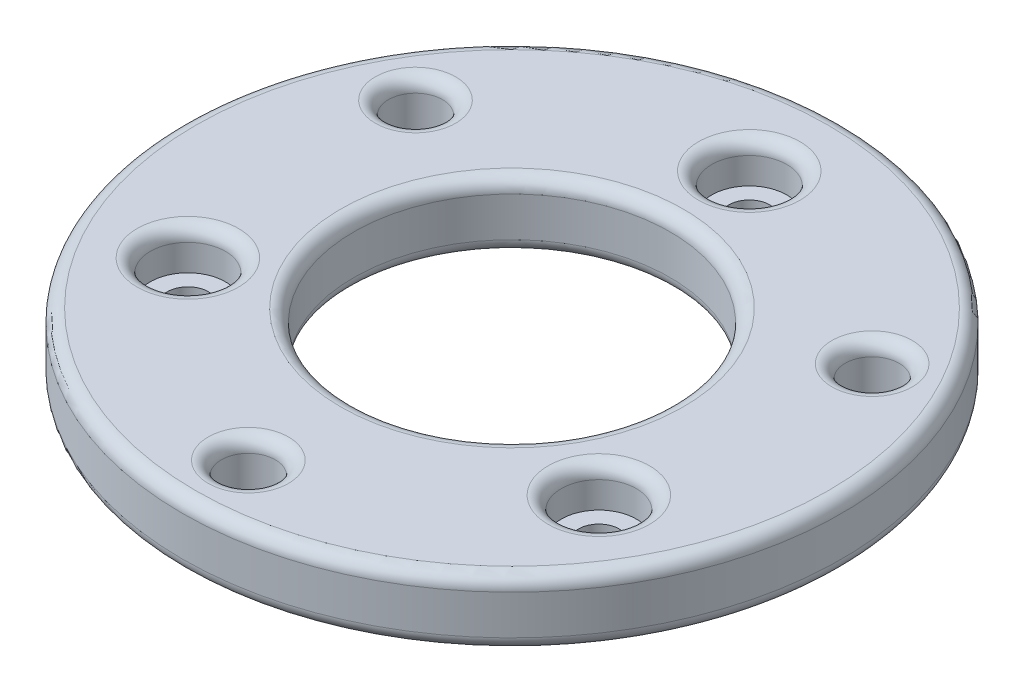
ISO-10303-21;
HEADER;
FILE_DESCRIPTION(('STEP AP214'),'2;1');
FILE_NAME('part.step','',(''),(''),'','','');
FILE_SCHEMA(('AUTOMOTIVE_DESIGN { 1 0 10303 214 1 1 1 1 }'));
ENDSEC;
DATA;
#1=APPLICATION_CONTEXT('core data for automotive mechanical design processes');
#2=APPLICATION_PROTOCOL_DEFINITION('international standard','automotive_design',2000,#1);
#3=PRODUCT_CONTEXT('',#1,'mechanical');
#4=PRODUCT('Part','Part','',(#3));
#5=PRODUCT_RELATED_PRODUCT_CATEGORY('part','',(#4));
#6=PRODUCT_DEFINITION_FORMATION('','',#4);
#7=PRODUCT_DEFINITION_CONTEXT('part definition',#1,'design');
#8=PRODUCT_DEFINITION('design','',#6,#7);
#9=PRODUCT_DEFINITION_SHAPE('','',#8);
#10=(LENGTH_UNIT() NAMED_UNIT(*) SI_UNIT(.MILLI.,.METRE.));
#11=(NAMED_UNIT(*) PLANE_ANGLE_UNIT() SI_UNIT($,.RADIAN.));
#12=(NAMED_UNIT(*) SI_UNIT($,.STERADIAN.) SOLID_ANGLE_UNIT());
#13=UNCERTAINTY_MEASURE_WITH_UNIT(LENGTH_MEASURE(1.E-05),#10,'distance_accuracy_value','');
#14=(GEOMETRIC_REPRESENTATION_CONTEXT(3) GLOBAL_UNCERTAINTY_ASSIGNED_CONTEXT((#13)) GLOBAL_UNIT_ASSIGNED_CONTEXT((#10,
#11,#12)) REPRESENTATION_CONTEXT('',''));
#15=CARTESIAN_POINT('',(0.,0.,0.));
#16=DIRECTION('',(0.,0.,1.));
#17=DIRECTION('',(1.,0.,0.));
#18=AXIS2_PLACEMENT_3D('',#15,#16,#17);
#19=CARTESIAN_POINT('',(0.,5.,-18.));
#20=DIRECTION('',(0.,-1.,0.));
#21=DIRECTION('',(0.,0.,-1.));
#22=AXIS2_PLACEMENT_3D('',#19,#20,#21);
#23=CYLINDRICAL_SURFACE('',#22,1.55);
#24=CARTESIAN_POINT('',(0.,1.,-18.));
#25=DIRECTION('',(0.,1.,0.));
#26=DIRECTION('',(0.,0.,1.));
#27=AXIS2_PLACEMENT_3D('',#24,#25,#26);
#28=CIRCLE('',#27,1.55);
#29=CARTESIAN_POINT('',(0.,1.,-16.45));
#30=VERTEX_POINT('',#29);
#31=EDGE_CURVE('E86',#30,#30,#28,.F.);
#32=ORIENTED_EDGE('',*,*,#31,.T.);
#33=EDGE_LOOP('',(#32));
#34=FACE_BOUND('',#33,.T.);
#35=CARTESIAN_POINT('',(0.,2.,-18.));
#36=DIRECTION('',(0.,1.,0.));
#37=DIRECTION('',(0.,0.,1.));
#38=AXIS2_PLACEMENT_3D('',#35,#36,#37);
#39=CIRCLE('',#38,1.55);
#40=CARTESIAN_POINT('',(0.,2.,-16.45));
#41=VERTEX_POINT('',#40);
#42=EDGE_CURVE('E137',#41,#41,#39,.T.);
#43=ORIENTED_EDGE('',*,*,#42,.T.);
#44=EDGE_LOOP('',(#43));
#45=FACE_BOUND('',#44,.T.);
#46=ADVANCED_FACE('F33',(#34,#45),#23,.F.);
#47=CARTESIAN_POINT('',(15.5884572681222,5.,8.99999999999867));
#48=DIRECTION('',(0.,-1.,0.));
#49=DIRECTION('',(0.,0.,-1.));
#50=AXIS2_PLACEMENT_3D('',#47,#48,#49);
#51=CYLINDRICAL_SURFACE('',#50,1.5500000000019);
#52=CARTESIAN_POINT('',(15.5884572681222,1.,8.99999999999867));
#53=DIRECTION('',(0.,1.,0.));
#54=DIRECTION('',(0.,0.,1.));
#55=AXIS2_PLACEMENT_3D('',#52,#53,#54);
#56=CIRCLE('',#55,1.5500000000019);
#57=CARTESIAN_POINT('',(15.5884572681222,1.,10.5500000000006));
#58=VERTEX_POINT('',#57);
#59=EDGE_CURVE('E95',#58,#58,#56,.F.);
#60=ORIENTED_EDGE('',*,*,#59,.T.);
#61=EDGE_LOOP('',(#60));
#62=FACE_BOUND('',#61,.T.);
#63=CARTESIAN_POINT('',(15.5884572681222,2.,8.99999999999867));
#64=DIRECTION('',(0.,1.,0.));
#65=DIRECTION('',(0.,0.,1.));
#66=AXIS2_PLACEMENT_3D('',#63,#64,#65);
#67=CIRCLE('',#66,1.5500000000019);
#68=CARTESIAN_POINT('',(15.5884572681222,2.,10.5500000000006));
#69=VERTEX_POINT('',#68);
#70=EDGE_CURVE('E140',#69,#69,#67,.T.);
#71=ORIENTED_EDGE('',*,*,#70,.T.);
#72=EDGE_LOOP('',(#71));
#73=FACE_BOUND('',#72,.T.);
#74=ADVANCED_FACE('F173',(#62,#73),#51,.F.);
#75=CARTESIAN_POINT('',(-15.5884572681176,5.,9.00000000000134));
#76=DIRECTION('',(0.,-1.,0.));
#77=DIRECTION('',(0.,0.,-1.));
#78=AXIS2_PLACEMENT_3D('',#75,#76,#77);
#79=CYLINDRICAL_SURFACE('',#78,1.55000000000275);
#80=CARTESIAN_POINT('',(-15.5884572681176,1.,9.00000000000134));
#81=DIRECTION('',(0.,1.,0.));
#82=DIRECTION('',(0.,0.,1.));
#83=AXIS2_PLACEMENT_3D('',#80,#81,#82);
#84=CIRCLE('',#83,1.55000000000275);
#85=CARTESIAN_POINT('',(-15.5884572681176,1.,10.5500000000041));
#86=VERTEX_POINT('',#85);
#87=EDGE_CURVE('E98',#86,#86,#84,.F.);
#88=ORIENTED_EDGE('',*,*,#87,.T.);
#89=EDGE_LOOP('',(#88));
#90=FACE_BOUND('',#89,.T.);
#91=CARTESIAN_POINT('',(-15.5884572681176,2.,9.00000000000134));
#92=DIRECTION('',(0.,1.,0.));
#93=DIRECTION('',(0.,0.,1.));
#94=AXIS2_PLACEMENT_3D('',#91,#92,#93);
#95=CIRCLE('',#94,1.55000000000275);
#96=CARTESIAN_POINT('',(-15.5884572681176,2.,10.5500000000041));
#97=VERTEX_POINT('',#96);
#98=EDGE_CURVE('E143',#97,#97,#95,.T.);
#99=ORIENTED_EDGE('',*,*,#98,.T.);
#100=EDGE_LOOP('',(#99));
#101=FACE_BOUND('',#100,.T.);
#102=ADVANCED_FACE('F179',(#90,#101),#79,.F.);
#103=CARTESIAN_POINT('',(0.,5.,0.));
#104=DIRECTION('',(0.,1.,0.));
#105=DIRECTION('',(0.,0.,1.));
#106=AXIS2_PLACEMENT_3D('',#103,#104,#105);
#107=PLANE('',#106);
#108=CARTESIAN_POINT('',(17.3205080756911,5.,-9.99999999999868));
#109=DIRECTION('',(0.,1.,0.));
#110=DIRECTION('',(0.,0.,1.));
#111=AXIS2_PLACEMENT_3D('',#108,#109,#110);
#112=CIRCLE('',#111,3.05000000000259);
#113=CARTESIAN_POINT('',(17.3205080756911,5.,-6.94999999999609));
#114=VERTEX_POINT('',#113);
#115=EDGE_CURVE('E48',#114,#114,#112,.F.);
#116=ORIENTED_EDGE('',*,*,#115,.T.);
#117=EDGE_LOOP('',(#116));
#118=FACE_BOUND('',#117,.T.);
#119=CARTESIAN_POINT('',(0.,5.,20.));
#120=DIRECTION('',(0.,1.,0.));
#121=DIRECTION('',(0.,0.,1.));
#122=AXIS2_PLACEMENT_3D('',#119,#120,#121);
#123=CIRCLE('',#122,3.05);
#124=CARTESIAN_POINT('',(0.,5.,23.05));
#125=VERTEX_POINT('',#124);
#126=EDGE_CURVE('E53',#125,#125,#123,.F.);
#127=ORIENTED_EDGE('',*,*,#126,.T.);
#128=EDGE_LOOP('',(#127));
#129=FACE_BOUND('',#128,.T.);
#130=CARTESIAN_POINT('',(0.,5.,0.));
#131=DIRECTION('',(0.,1.,0.));
#132=DIRECTION('',(0.,0.,1.));
#133=AXIS2_PLACEMENT_3D('',#130,#131,#132);
#134=CIRCLE('',#133,13.);
#135=CARTESIAN_POINT('',(0.,5.,13.));
#136=VERTEX_POINT('',#135);
#137=EDGE_CURVE('E56',#136,#136,#134,.F.);
#138=ORIENTED_EDGE('',*,*,#137,.T.);
#139=EDGE_LOOP('',(#138));
#140=FACE_BOUND('',#139,.T.);
#141=CARTESIAN_POINT('',(0.,5.,0.));
#142=DIRECTION('',(0.,1.,0.));
#143=DIRECTION('',(0.,0.,1.));
#144=AXIS2_PLACEMENT_3D('',#141,#142,#143);
#145=CIRCLE('',#144,24.);
#146=CARTESIAN_POINT('',(0.,5.,24.));
#147=VERTEX_POINT('',#146);
#148=EDGE_CURVE('E59',#147,#147,#145,.T.);
#149=ORIENTED_EDGE('',*,*,#148,.T.);
#150=EDGE_LOOP('',(#149));
#151=FACE_BOUND('',#150,.T.);
#152=CARTESIAN_POINT('',(-17.3205080756865,5.,-10.0000000000013));
#153=DIRECTION('',(0.,1.,0.));
#154=DIRECTION('',(0.,0.,1.));
#155=AXIS2_PLACEMENT_3D('',#152,#153,#154);
#156=CIRCLE('',#155,3.05000000000181);
#157=CARTESIAN_POINT('',(-17.3205080756865,5.,-6.94999999999952));
#158=VERTEX_POINT('',#157);
#159=EDGE_CURVE('E62',#158,#158,#156,.F.);
#160=ORIENTED_EDGE('',*,*,#159,.T.);
#161=EDGE_LOOP('',(#160));
#162=FACE_BOUND('',#161,.T.);
#163=CARTESIAN_POINT('',(-15.5884572681187,5.,9.00000000000067));
#164=DIRECTION('',(0.,1.,0.));
#165=DIRECTION('',(0.,0.,1.));
#166=AXIS2_PLACEMENT_3D('',#163,#164,#165);
#167=CIRCLE('',#166,3.85000000000146);
#168=CARTESIAN_POINT('',(-15.5884572681187,5.,12.8500000000021));
#169=VERTEX_POINT('',#168);
#170=EDGE_CURVE('E65',#169,#169,#167,.F.);
#171=ORIENTED_EDGE('',*,*,#170,.T.);
#172=EDGE_LOOP('',(#171));
#173=FACE_BOUND('',#172,.T.);
#174=CARTESIAN_POINT('',(15.588457268121,5.,8.99999999999933));
#175=DIRECTION('',(0.,1.,0.));
#176=DIRECTION('',(0.,0.,1.));
#177=AXIS2_PLACEMENT_3D('',#174,#175,#176);
#178=CIRCLE('',#177,3.85000000000099);
#179=CARTESIAN_POINT('',(15.588457268121,5.,12.8500000000003));
#180=VERTEX_POINT('',#179);
#181=EDGE_CURVE('E68',#180,#180,#178,.F.);
#182=ORIENTED_EDGE('',*,*,#181,.T.);
#183=EDGE_LOOP('',(#182));
#184=FACE_BOUND('',#183,.T.);
#185=CARTESIAN_POINT('',(0.,5.,-18.));
#186=DIRECTION('',(0.,1.,0.));
#187=DIRECTION('',(0.,0.,1.));
#188=AXIS2_PLACEMENT_3D('',#185,#186,#187);
#189=CIRCLE('',#188,3.85);
#190=CARTESIAN_POINT('',(0.,5.,-14.15));
#191=VERTEX_POINT('',#190);
#192=EDGE_CURVE('E71',#191,#191,#189,.F.);
#193=ORIENTED_EDGE('',*,*,#192,.T.);
#194=EDGE_LOOP('',(#193));
#195=FACE_BOUND('',#194,.T.);
#196=ADVANCED_FACE('F191',(#118,#129,#140,#151,#162,#173,#184,#195),#107,.T.);
#197=CARTESIAN_POINT('',(0.,0.,0.));
#198=DIRECTION('',(0.,1.,0.));
#199=DIRECTION('',(0.,0.,1.));
#200=AXIS2_PLACEMENT_3D('',#197,#198,#199);
#201=PLANE('',#200);
#202=CARTESIAN_POINT('',(17.3205080756911,0.,-9.99999999999868));
#203=DIRECTION('',(0.,1.,0.));
#204=DIRECTION('',(0.,0.,1.));
#205=AXIS2_PLACEMENT_3D('',#202,#203,#204);
#206=CIRCLE('',#205,3.05000000000259);
#207=CARTESIAN_POINT('',(17.3205080756911,0.,-6.94999999999609));
#208=VERTEX_POINT('',#207);
#209=EDGE_CURVE('E113',#208,#208,#206,.T.);
#210=ORIENTED_EDGE('',*,*,#209,.T.);
#211=EDGE_LOOP('',(#210));
#212=FACE_BOUND('',#211,.T.);
#213=CARTESIAN_POINT('',(-17.3205080756865,0.,-10.0000000000013));
#214=DIRECTION('',(0.,1.,0.));
#215=DIRECTION('',(0.,0.,1.));
#216=AXIS2_PLACEMENT_3D('',#213,#214,#215);
#217=CIRCLE('',#216,3.05000000000181);
#218=CARTESIAN_POINT('',(-17.3205080756865,0.,-6.94999999999952));
#219=VERTEX_POINT('',#218);
#220=EDGE_CURVE('E116',#219,#219,#217,.T.);
#221=ORIENTED_EDGE('',*,*,#220,.T.);
#222=EDGE_LOOP('',(#221));
#223=FACE_BOUND('',#222,.T.);
#224=CARTESIAN_POINT('',(-15.5884572681176,0.,9.00000000000134));
#225=DIRECTION('',(0.,1.,0.));
#226=DIRECTION('',(0.,0.,1.));
#227=AXIS2_PLACEMENT_3D('',#224,#225,#226);
#228=CIRCLE('',#227,2.55000000000275);
#229=CARTESIAN_POINT('',(-15.5884572681176,0.,11.5500000000041));
#230=VERTEX_POINT('',#229);
#231=EDGE_CURVE('E119',#230,#230,#228,.T.);
#232=ORIENTED_EDGE('',*,*,#231,.T.);
#233=EDGE_LOOP('',(#232));
#234=FACE_BOUND('',#233,.T.);
#235=CARTESIAN_POINT('',(15.5884572681222,0.,8.99999999999867));
#236=DIRECTION('',(0.,1.,0.));
#237=DIRECTION('',(0.,0.,1.));
#238=AXIS2_PLACEMENT_3D('',#235,#236,#237);
#239=CIRCLE('',#238,2.5500000000019);
#240=CARTESIAN_POINT('',(15.5884572681222,0.,11.5500000000006));
#241=VERTEX_POINT('',#240);
#242=EDGE_CURVE('E122',#241,#241,#239,.T.);
#243=ORIENTED_EDGE('',*,*,#242,.T.);
#244=EDGE_LOOP('',(#243));
#245=FACE_BOUND('',#244,.T.);
#246=CARTESIAN_POINT('',(0.,0.,20.));
#247=DIRECTION('',(0.,1.,0.));
#248=DIRECTION('',(0.,0.,1.));
#249=AXIS2_PLACEMENT_3D('',#246,#247,#248);
#250=CIRCLE('',#249,3.05);
#251=CARTESIAN_POINT('',(0.,0.,23.05));
#252=VERTEX_POINT('',#251);
#253=EDGE_CURVE('E125',#252,#252,#250,.T.);
#254=ORIENTED_EDGE('',*,*,#253,.T.);
#255=EDGE_LOOP('',(#254));
#256=FACE_BOUND('',#255,.T.);
#257=CARTESIAN_POINT('',(0.,0.,-18.));
#258=DIRECTION('',(0.,1.,0.));
#259=DIRECTION('',(0.,0.,1.));
#260=AXIS2_PLACEMENT_3D('',#257,#258,#259);
#261=CIRCLE('',#260,2.55);
#262=CARTESIAN_POINT('',(0.,0.,-15.45));
#263=VERTEX_POINT('',#262);
#264=EDGE_CURVE('E128',#263,#263,#261,.T.);
#265=ORIENTED_EDGE('',*,*,#264,.T.);
#266=EDGE_LOOP('',(#265));
#267=FACE_BOUND('',#266,.T.);
#268=CARTESIAN_POINT('',(0.,0.,0.));
#269=DIRECTION('',(0.,1.,0.));
#270=DIRECTION('',(0.,0.,1.));
#271=AXIS2_PLACEMENT_3D('',#268,#269,#270);
#272=CIRCLE('',#271,13.);
#273=CARTESIAN_POINT('',(0.,0.,13.));
#274=VERTEX_POINT('',#273);
#275=EDGE_CURVE('E131',#274,#274,#272,.T.);
#276=ORIENTED_EDGE('',*,*,#275,.T.);
#277=EDGE_LOOP('',(#276));
#278=FACE_BOUND('',#277,.T.);
#279=CARTESIAN_POINT('',(0.,0.,0.));
#280=DIRECTION('',(0.,1.,0.));
#281=DIRECTION('',(0.,0.,1.));
#282=AXIS2_PLACEMENT_3D('',#279,#280,#281);
#283=CIRCLE('',#282,24.);
#284=CARTESIAN_POINT('',(0.,0.,24.));
#285=VERTEX_POINT('',#284);
#286=EDGE_CURVE('E134',#285,#285,#283,.F.);
#287=ORIENTED_EDGE('',*,*,#286,.T.);
#288=EDGE_LOOP('',(#287));
#289=FACE_BOUND('',#288,.T.);
#290=ADVANCED_FACE('F194',(#212,#223,#234,#245,#256,#267,#278,#289),#201,.F.);
#291=CARTESIAN_POINT('',(0.,5.,0.));
#292=DIRECTION('',(0.,-1.,0.));
#293=DIRECTION('',(0.,0.,-1.));
#294=AXIS2_PLACEMENT_3D('',#291,#292,#293);
#295=CYLINDRICAL_SURFACE('',#294,25.);
#296=CARTESIAN_POINT('',(0.,1.,0.));
#297=DIRECTION('',(0.,1.,0.));
#298=DIRECTION('',(0.,0.,1.));
#299=AXIS2_PLACEMENT_3D('',#296,#297,#298);
#300=CIRCLE('',#299,25.);
#301=CARTESIAN_POINT('',(0.,1.,25.));
#302=VERTEX_POINT('',#301);
#303=EDGE_CURVE('E74',#302,#302,#300,.T.);
#304=ORIENTED_EDGE('',*,*,#303,.T.);
#305=EDGE_LOOP('',(#304));
#306=FACE_BOUND('',#305,.T.);
#307=CARTESIAN_POINT('',(0.,4.,0.));
#308=DIRECTION('',(0.,1.,0.));
#309=DIRECTION('',(0.,0.,1.));
#310=AXIS2_PLACEMENT_3D('',#307,#308,#309);
#311=CIRCLE('',#310,25.);
#312=CARTESIAN_POINT('',(0.,4.,25.));
#313=VERTEX_POINT('',#312);
#314=EDGE_CURVE('E77',#313,#313,#311,.F.);
#315=ORIENTED_EDGE('',*,*,#314,.T.);
#316=EDGE_LOOP('',(#315));
#317=FACE_BOUND('',#316,.T.);
#318=ADVANCED_FACE('F189',(#306,#317),#295,.T.);
#319=CARTESIAN_POINT('',(0.,5.,0.));
#320=DIRECTION('',(0.,-1.,0.));
#321=DIRECTION('',(0.,0.,-1.));
#322=AXIS2_PLACEMENT_3D('',#319,#320,#321);
#323=CYLINDRICAL_SURFACE('',#322,12.);
#324=CARTESIAN_POINT('',(0.,1.,0.));
#325=DIRECTION('',(0.,1.,0.));
#326=DIRECTION('',(0.,0.,1.));
#327=AXIS2_PLACEMENT_3D('',#324,#325,#326);
#328=CIRCLE('',#327,12.);
#329=CARTESIAN_POINT('',(0.,1.,12.));
#330=VERTEX_POINT('',#329);
#331=EDGE_CURVE('E80',#330,#330,#328,.F.);
#332=ORIENTED_EDGE('',*,*,#331,.T.);
#333=EDGE_LOOP('',(#332));
#334=FACE_BOUND('',#333,.T.);
#335=CARTESIAN_POINT('',(0.,4.,0.));
#336=DIRECTION('',(0.,1.,0.));
#337=DIRECTION('',(0.,0.,1.));
#338=AXIS2_PLACEMENT_3D('',#335,#336,#337);
#339=CIRCLE('',#338,12.);
#340=CARTESIAN_POINT('',(0.,4.,12.));
#341=VERTEX_POINT('',#340);
#342=EDGE_CURVE('E83',#341,#341,#339,.T.);
#343=ORIENTED_EDGE('',*,*,#342,.T.);
#344=EDGE_LOOP('',(#343));
#345=FACE_BOUND('',#344,.T.);
#346=ADVANCED_FACE('F186',(#334,#345),#323,.F.);
#347=CARTESIAN_POINT('',(0.,5.,20.));
#348=DIRECTION('',(0.,-1.,0.));
#349=DIRECTION('',(0.,0.,-1.));
#350=AXIS2_PLACEMENT_3D('',#347,#348,#349);
#351=CYLINDRICAL_SURFACE('',#350,2.05);
#352=CARTESIAN_POINT('',(0.,1.,20.));
#353=DIRECTION('',(0.,1.,0.));
#354=DIRECTION('',(0.,0.,1.));
#355=AXIS2_PLACEMENT_3D('',#352,#353,#354);
#356=CIRCLE('',#355,2.05);
#357=CARTESIAN_POINT('',(0.,1.,22.05));
#358=VERTEX_POINT('',#357);
#359=EDGE_CURVE('E89',#358,#358,#356,.F.);
#360=ORIENTED_EDGE('',*,*,#359,.T.);
#361=EDGE_LOOP('',(#360));
#362=FACE_BOUND('',#361,.T.);
#363=CARTESIAN_POINT('',(0.,4.,20.));
#364=DIRECTION('',(0.,1.,0.));
#365=DIRECTION('',(0.,0.,1.));
#366=AXIS2_PLACEMENT_3D('',#363,#364,#365);
#367=CIRCLE('',#366,2.05);
#368=CARTESIAN_POINT('',(0.,4.,22.05));
#369=VERTEX_POINT('',#368);
#370=EDGE_CURVE('E92',#369,#369,#367,.T.);
#371=ORIENTED_EDGE('',*,*,#370,.T.);
#372=EDGE_LOOP('',(#371));
#373=FACE_BOUND('',#372,.T.);
#374=ADVANCED_FACE('F185',(#362,#373),#351,.F.);
#375=CARTESIAN_POINT('',(-17.3205080756865,5.,-10.0000000000013));
#376=DIRECTION('',(0.,-1.,0.));
#377=DIRECTION('',(0.,0.,-1.));
#378=AXIS2_PLACEMENT_3D('',#375,#376,#377);
#379=CYLINDRICAL_SURFACE('',#378,2.05000000000181);
#380=CARTESIAN_POINT('',(-17.3205080756865,1.,-10.0000000000013));
#381=DIRECTION('',(0.,1.,0.));
#382=DIRECTION('',(0.,0.,1.));
#383=AXIS2_PLACEMENT_3D('',#380,#381,#382);
#384=CIRCLE('',#383,2.05000000000181);
#385=CARTESIAN_POINT('',(-17.3205080756865,1.,-7.94999999999952));
#386=VERTEX_POINT('',#385);
#387=EDGE_CURVE('E101',#386,#386,#384,.F.);
#388=ORIENTED_EDGE('',*,*,#387,.T.);
#389=EDGE_LOOP('',(#388));
#390=FACE_BOUND('',#389,.T.);
#391=CARTESIAN_POINT('',(-17.3205080756865,4.,-10.0000000000013));
#392=DIRECTION('',(0.,1.,0.));
#393=DIRECTION('',(0.,0.,1.));
#394=AXIS2_PLACEMENT_3D('',#391,#392,#393);
#395=CIRCLE('',#394,2.05000000000181);
#396=CARTESIAN_POINT('',(-17.3205080756865,4.,-7.94999999999952));
#397=VERTEX_POINT('',#396);
#398=EDGE_CURVE('E104',#397,#397,#395,.T.);
#399=ORIENTED_EDGE('',*,*,#398,.T.);
#400=EDGE_LOOP('',(#399));
#401=FACE_BOUND('',#400,.T.);
#402=ADVANCED_FACE('F397',(#390,#401),#379,.F.);
#403=CARTESIAN_POINT('',(17.3205080756911,5.,-9.99999999999868));
#404=DIRECTION('',(0.,-1.,0.));
#405=DIRECTION('',(0.,0.,-1.));
#406=AXIS2_PLACEMENT_3D('',#403,#404,#405);
#407=CYLINDRICAL_SURFACE('',#406,2.05000000000259);
#408=CARTESIAN_POINT('',(17.3205080756911,1.,-9.99999999999868));
#409=DIRECTION('',(0.,1.,0.));
#410=DIRECTION('',(0.,0.,1.));
#411=AXIS2_PLACEMENT_3D('',#408,#409,#410);
#412=CIRCLE('',#411,2.05000000000259);
#413=CARTESIAN_POINT('',(17.3205080756911,1.,-7.9499999999961));
#414=VERTEX_POINT('',#413);
#415=EDGE_CURVE('E107',#414,#414,#412,.F.);
#416=ORIENTED_EDGE('',*,*,#415,.T.);
#417=EDGE_LOOP('',(#416));
#418=FACE_BOUND('',#417,.T.);
#419=CARTESIAN_POINT('',(17.3205080756911,4.,-9.99999999999868));
#420=DIRECTION('',(0.,1.,0.));
#421=DIRECTION('',(0.,0.,1.));
#422=AXIS2_PLACEMENT_3D('',#419,#420,#421);
#423=CIRCLE('',#422,2.05000000000259);
#424=CARTESIAN_POINT('',(17.3205080756911,4.,-7.9499999999961));
#425=VERTEX_POINT('',#424);
#426=EDGE_CURVE('E110',#425,#425,#423,.T.);
#427=ORIENTED_EDGE('',*,*,#426,.T.);
#428=EDGE_LOOP('',(#427));
#429=FACE_BOUND('',#428,.T.);
#430=ADVANCED_FACE('F386',(#418,#429),#407,.F.);
#431=CARTESIAN_POINT('',(-15.5884572681187,2.,9.00000000000067));
#432=DIRECTION('',(0.,1.,0.));
#433=DIRECTION('',(0.,0.,1.));
#434=AXIS2_PLACEMENT_3D('',#431,#432,#433);
#435=CYLINDRICAL_SURFACE('',#434,2.85000000000146);
#436=CARTESIAN_POINT('',(-15.5884572681187,4.,9.00000000000067));
#437=DIRECTION('',(0.,1.,0.));
#438=DIRECTION('',(0.,0.,1.));
#439=AXIS2_PLACEMENT_3D('',#436,#437,#438);
#440=CIRCLE('',#439,2.85000000000146);
#441=CARTESIAN_POINT('',(-15.5884572681187,4.,11.8500000000021));
#442=VERTEX_POINT('',#441);
#443=EDGE_CURVE('E44',#442,#442,#440,.T.);
#444=ORIENTED_EDGE('',*,*,#443,.T.);
#445=EDGE_LOOP('',(#444));
#446=FACE_BOUND('',#445,.T.);
#447=CARTESIAN_POINT('',(-15.5884572681187,2.,9.00000000000067));
#448=DIRECTION('',(0.,1.,0.));
#449=DIRECTION('',(0.,0.,1.));
#450=AXIS2_PLACEMENT_3D('',#447,#448,#449);
#451=CIRCLE('',#450,2.85000000000146);
#452=CARTESIAN_POINT('',(-15.5884572681187,2.,11.8500000000021));
#453=VERTEX_POINT('',#452);
#454=EDGE_CURVE('E147',#453,#453,#451,.T.);
#455=ORIENTED_EDGE('',*,*,#454,.F.);
#456=EDGE_LOOP('',(#455));
#457=FACE_BOUND('',#456,.T.);
#458=ADVANCED_FACE('F381',(#446,#457),#435,.F.);
#459=CARTESIAN_POINT('',(-15.5884572681187,2.,9.00000000000067));
#460=DIRECTION('',(0.,1.,0.));
#461=DIRECTION('',(0.,0.,1.));
#462=AXIS2_PLACEMENT_3D('',#459,#460,#461);
#463=PLANE('',#462);
#464=ORIENTED_EDGE('',*,*,#98,.F.);
#465=EDGE_LOOP('',(#464));
#466=FACE_BOUND('',#465,.T.);
#467=ORIENTED_EDGE('',*,*,#454,.T.);
#468=EDGE_LOOP('',(#467));
#469=FACE_BOUND('',#468,.T.);
#470=ADVANCED_FACE('F374',(#466,#469),#463,.T.);
#471=CARTESIAN_POINT('',(15.588457268121,2.,8.99999999999933));
#472=DIRECTION('',(0.,1.,0.));
#473=DIRECTION('',(0.,0.,1.));
#474=AXIS2_PLACEMENT_3D('',#471,#472,#473);
#475=CYLINDRICAL_SURFACE('',#474,2.85000000000099);
#476=CARTESIAN_POINT('',(15.588457268121,4.,8.99999999999933));
#477=DIRECTION('',(0.,1.,0.));
#478=DIRECTION('',(0.,0.,1.));
#479=AXIS2_PLACEMENT_3D('',#476,#477,#478);
#480=CIRCLE('',#479,2.85000000000099);
#481=CARTESIAN_POINT('',(15.588457268121,4.,11.8500000000003));
#482=VERTEX_POINT('',#481);
#483=EDGE_CURVE('E40',#482,#482,#480,.T.);
#484=ORIENTED_EDGE('',*,*,#483,.T.);
#485=EDGE_LOOP('',(#484));
#486=FACE_BOUND('',#485,.T.);
#487=CARTESIAN_POINT('',(15.588457268121,2.,8.99999999999933));
#488=DIRECTION('',(0.,1.,0.));
#489=DIRECTION('',(0.,0.,1.));
#490=AXIS2_PLACEMENT_3D('',#487,#488,#489);
#491=CIRCLE('',#490,2.85000000000099);
#492=CARTESIAN_POINT('',(15.588457268121,2.,11.8500000000003));
#493=VERTEX_POINT('',#492);
#494=EDGE_CURVE('E150',#493,#493,#491,.T.);
#495=ORIENTED_EDGE('',*,*,#494,.F.);
#496=EDGE_LOOP('',(#495));
#497=FACE_BOUND('',#496,.T.);
#498=ADVANCED_FACE('F169',(#486,#497),#475,.F.);
#499=CARTESIAN_POINT('',(15.588457268121,2.,8.99999999999933));
#500=DIRECTION('',(0.,1.,0.));
#501=DIRECTION('',(0.,0.,1.));
#502=AXIS2_PLACEMENT_3D('',#499,#500,#501);
#503=PLANE('',#502);
#504=ORIENTED_EDGE('',*,*,#70,.F.);
#505=EDGE_LOOP('',(#504));
#506=FACE_BOUND('',#505,.T.);
#507=ORIENTED_EDGE('',*,*,#494,.T.);
#508=EDGE_LOOP('',(#507));
#509=FACE_BOUND('',#508,.T.);
#510=ADVANCED_FACE('F160',(#506,#509),#503,.T.);
#511=CARTESIAN_POINT('',(0.,2.,-18.));
#512=DIRECTION('',(0.,1.,0.));
#513=DIRECTION('',(0.,0.,1.));
#514=AXIS2_PLACEMENT_3D('',#511,#512,#513);
#515=CYLINDRICAL_SURFACE('',#514,2.85);
#516=CARTESIAN_POINT('',(0.,4.,-18.));
#517=DIRECTION('',(0.,1.,0.));
#518=DIRECTION('',(0.,0.,1.));
#519=AXIS2_PLACEMENT_3D('',#516,#517,#518);
#520=CIRCLE('',#519,2.85);
#521=CARTESIAN_POINT('',(0.,4.,-15.15));
#522=VERTEX_POINT('',#521);
#523=EDGE_CURVE('E10',#522,#522,#520,.T.);
#524=ORIENTED_EDGE('',*,*,#523,.T.);
#525=EDGE_LOOP('',(#524));
#526=FACE_BOUND('',#525,.T.);
#527=CARTESIAN_POINT('',(0.,2.,-18.));
#528=DIRECTION('',(0.,1.,0.));
#529=DIRECTION('',(0.,0.,1.));
#530=AXIS2_PLACEMENT_3D('',#527,#528,#529);
#531=CIRCLE('',#530,2.85);
#532=CARTESIAN_POINT('',(0.,2.,-15.15));
#533=VERTEX_POINT('',#532);
#534=EDGE_CURVE('E146',#533,#533,#531,.T.);
#535=ORIENTED_EDGE('',*,*,#534,.F.);
#536=EDGE_LOOP('',(#535));
#537=FACE_BOUND('',#536,.T.);
#538=ADVANCED_FACE('F158',(#526,#537),#515,.F.);
#539=CARTESIAN_POINT('',(0.,2.,-18.));
#540=DIRECTION('',(0.,1.,0.));
#541=DIRECTION('',(0.,0.,1.));
#542=AXIS2_PLACEMENT_3D('',#539,#540,#541);
#543=PLANE('',#542);
#544=ORIENTED_EDGE('',*,*,#42,.F.);
#545=EDGE_LOOP('',(#544));
#546=FACE_BOUND('',#545,.T.);
#547=ORIENTED_EDGE('',*,*,#534,.T.);
#548=EDGE_LOOP('',(#547));
#549=FACE_BOUND('',#548,.T.);
#550=ADVANCED_FACE('F156',(#546,#549),#543,.T.);
#551=CARTESIAN_POINT('',(17.3205080756911,1.,-9.99999999999868));
#552=DIRECTION('',(0.,1.,0.));
#553=DIRECTION('',(0.,0.,1.));
#554=AXIS2_PLACEMENT_3D('',#551,#552,#553);
#555=TOROIDAL_SURFACE('',#554,3.05000000000259,1.);
#556=ORIENTED_EDGE('',*,*,#415,.F.);
#557=EDGE_LOOP('',(#556));
#558=FACE_BOUND('',#557,.T.);
#559=ORIENTED_EDGE('',*,*,#209,.F.);
#560=EDGE_LOOP('',(#559));
#561=FACE_BOUND('',#560,.T.);
#562=ADVANCED_FACE('F166',(#558,#561),#555,.T.);
#563=CARTESIAN_POINT('',(-17.3205080756865,1.,-10.0000000000013));
#564=DIRECTION('',(0.,1.,0.));
#565=DIRECTION('',(0.,0.,1.));
#566=AXIS2_PLACEMENT_3D('',#563,#564,#565);
#567=TOROIDAL_SURFACE('',#566,3.05000000000181,1.);
#568=ORIENTED_EDGE('',*,*,#387,.F.);
#569=EDGE_LOOP('',(#568));
#570=FACE_BOUND('',#569,.T.);
#571=ORIENTED_EDGE('',*,*,#220,.F.);
#572=EDGE_LOOP('',(#571));
#573=FACE_BOUND('',#572,.T.);
#574=ADVANCED_FACE('F204',(#570,#573),#567,.T.);
#575=CARTESIAN_POINT('',(-15.5884572681176,1.,9.00000000000134));
#576=DIRECTION('',(0.,1.,0.));
#577=DIRECTION('',(0.,0.,1.));
#578=AXIS2_PLACEMENT_3D('',#575,#576,#577);
#579=TOROIDAL_SURFACE('',#578,2.55000000000275,1.);
#580=ORIENTED_EDGE('',*,*,#87,.F.);
#581=EDGE_LOOP('',(#580));
#582=FACE_BOUND('',#581,.T.);
#583=ORIENTED_EDGE('',*,*,#231,.F.);
#584=EDGE_LOOP('',(#583));
#585=FACE_BOUND('',#584,.T.);
#586=ADVANCED_FACE('F208',(#582,#585),#579,.T.);
#587=CARTESIAN_POINT('',(15.5884572681222,1.,8.99999999999867));
#588=DIRECTION('',(0.,1.,0.));
#589=DIRECTION('',(0.,0.,1.));
#590=AXIS2_PLACEMENT_3D('',#587,#588,#589);
#591=TOROIDAL_SURFACE('',#590,2.5500000000019,1.);
#592=ORIENTED_EDGE('',*,*,#59,.F.);
#593=EDGE_LOOP('',(#592));
#594=FACE_BOUND('',#593,.T.);
#595=ORIENTED_EDGE('',*,*,#242,.F.);
#596=EDGE_LOOP('',(#595));
#597=FACE_BOUND('',#596,.T.);
#598=ADVANCED_FACE('F212',(#594,#597),#591,.T.);
#599=CARTESIAN_POINT('',(0.,1.,20.));
#600=DIRECTION('',(0.,1.,0.));
#601=DIRECTION('',(0.,0.,1.));
#602=AXIS2_PLACEMENT_3D('',#599,#600,#601);
#603=TOROIDAL_SURFACE('',#602,3.05,1.);
#604=ORIENTED_EDGE('',*,*,#359,.F.);
#605=EDGE_LOOP('',(#604));
#606=FACE_BOUND('',#605,.T.);
#607=ORIENTED_EDGE('',*,*,#253,.F.);
#608=EDGE_LOOP('',(#607));
#609=FACE_BOUND('',#608,.T.);
#610=ADVANCED_FACE('F216',(#606,#609),#603,.T.);
#611=CARTESIAN_POINT('',(0.,1.,-18.));
#612=DIRECTION('',(0.,1.,0.));
#613=DIRECTION('',(0.,0.,1.));
#614=AXIS2_PLACEMENT_3D('',#611,#612,#613);
#615=TOROIDAL_SURFACE('',#614,2.55,1.);
#616=ORIENTED_EDGE('',*,*,#31,.F.);
#617=EDGE_LOOP('',(#616));
#618=FACE_BOUND('',#617,.T.);
#619=ORIENTED_EDGE('',*,*,#264,.F.);
#620=EDGE_LOOP('',(#619));
#621=FACE_BOUND('',#620,.T.);
#622=ADVANCED_FACE('F220',(#618,#621),#615,.T.);
#623=CARTESIAN_POINT('',(0.,1.,0.));
#624=DIRECTION('',(0.,1.,0.));
#625=DIRECTION('',(0.,0.,1.));
#626=AXIS2_PLACEMENT_3D('',#623,#624,#625);
#627=TOROIDAL_SURFACE('',#626,13.,1.);
#628=ORIENTED_EDGE('',*,*,#331,.F.);
#629=EDGE_LOOP('',(#628));
#630=FACE_BOUND('',#629,.T.);
#631=ORIENTED_EDGE('',*,*,#275,.F.);
#632=EDGE_LOOP('',(#631));
#633=FACE_BOUND('',#632,.T.);
#634=ADVANCED_FACE('F224',(#630,#633),#627,.T.);
#635=CARTESIAN_POINT('',(0.,1.,0.));
#636=DIRECTION('',(0.,1.,0.));
#637=DIRECTION('',(0.,0.,1.));
#638=AXIS2_PLACEMENT_3D('',#635,#636,#637);
#639=TOROIDAL_SURFACE('',#638,24.,1.);
#640=ORIENTED_EDGE('',*,*,#286,.F.);
#641=EDGE_LOOP('',(#640));
#642=FACE_BOUND('',#641,.T.);
#643=ORIENTED_EDGE('',*,*,#303,.F.);
#644=EDGE_LOOP('',(#643));
#645=FACE_BOUND('',#644,.T.);
#646=ADVANCED_FACE('F228',(#642,#645),#639,.T.);
#647=CARTESIAN_POINT('',(17.3205080756911,4.,-9.99999999999868));
#648=DIRECTION('',(0.,1.,0.));
#649=DIRECTION('',(0.,0.,1.));
#650=AXIS2_PLACEMENT_3D('',#647,#648,#649);
#651=TOROIDAL_SURFACE('',#650,3.05000000000259,1.);
#652=ORIENTED_EDGE('',*,*,#115,.F.);
#653=EDGE_LOOP('',(#652));
#654=FACE_BOUND('',#653,.T.);
#655=ORIENTED_EDGE('',*,*,#426,.F.);
#656=EDGE_LOOP('',(#655));
#657=FACE_BOUND('',#656,.T.);
#658=ADVANCED_FACE('F232',(#654,#657),#651,.T.);
#659=CARTESIAN_POINT('',(0.,4.,20.));
#660=DIRECTION('',(0.,1.,0.));
#661=DIRECTION('',(0.,0.,1.));
#662=AXIS2_PLACEMENT_3D('',#659,#660,#661);
#663=TOROIDAL_SURFACE('',#662,3.05,1.);
#664=ORIENTED_EDGE('',*,*,#126,.F.);
#665=EDGE_LOOP('',(#664));
#666=FACE_BOUND('',#665,.T.);
#667=ORIENTED_EDGE('',*,*,#370,.F.);
#668=EDGE_LOOP('',(#667));
#669=FACE_BOUND('',#668,.T.);
#670=ADVANCED_FACE('F236',(#666,#669),#663,.T.);
#671=CARTESIAN_POINT('',(0.,4.,0.));
#672=DIRECTION('',(0.,1.,0.));
#673=DIRECTION('',(0.,0.,1.));
#674=AXIS2_PLACEMENT_3D('',#671,#672,#673);
#675=TOROIDAL_SURFACE('',#674,13.,1.);
#676=ORIENTED_EDGE('',*,*,#137,.F.);
#677=EDGE_LOOP('',(#676));
#678=FACE_BOUND('',#677,.T.);
#679=ORIENTED_EDGE('',*,*,#342,.F.);
#680=EDGE_LOOP('',(#679));
#681=FACE_BOUND('',#680,.T.);
#682=ADVANCED_FACE('F240',(#678,#681),#675,.T.);
#683=CARTESIAN_POINT('',(0.,4.,0.));
#684=DIRECTION('',(0.,1.,0.));
#685=DIRECTION('',(0.,0.,1.));
#686=AXIS2_PLACEMENT_3D('',#683,#684,#685);
#687=TOROIDAL_SURFACE('',#686,24.,1.);
#688=ORIENTED_EDGE('',*,*,#314,.F.);
#689=EDGE_LOOP('',(#688));
#690=FACE_BOUND('',#689,.T.);
#691=ORIENTED_EDGE('',*,*,#148,.F.);
#692=EDGE_LOOP('',(#691));
#693=FACE_BOUND('',#692,.T.);
#694=ADVANCED_FACE('F244',(#690,#693),#687,.T.);
#695=CARTESIAN_POINT('',(-17.3205080756865,4.,-10.0000000000013));
#696=DIRECTION('',(0.,1.,0.));
#697=DIRECTION('',(0.,0.,1.));
#698=AXIS2_PLACEMENT_3D('',#695,#696,#697);
#699=TOROIDAL_SURFACE('',#698,3.05000000000181,1.);
#700=ORIENTED_EDGE('',*,*,#159,.F.);
#701=EDGE_LOOP('',(#700));
#702=FACE_BOUND('',#701,.T.);
#703=ORIENTED_EDGE('',*,*,#398,.F.);
#704=EDGE_LOOP('',(#703));
#705=FACE_BOUND('',#704,.T.);
#706=ADVANCED_FACE('F248',(#702,#705),#699,.T.);
#707=CARTESIAN_POINT('',(-15.5884572681187,4.,9.00000000000067));
#708=DIRECTION('',(0.,1.,0.));
#709=DIRECTION('',(0.,0.,1.));
#710=AXIS2_PLACEMENT_3D('',#707,#708,#709);
#711=TOROIDAL_SURFACE('',#710,3.85000000000146,1.);
#712=ORIENTED_EDGE('',*,*,#170,.F.);
#713=EDGE_LOOP('',(#712));
#714=FACE_BOUND('',#713,.T.);
#715=ORIENTED_EDGE('',*,*,#443,.F.);
#716=EDGE_LOOP('',(#715));
#717=FACE_BOUND('',#716,.T.);
#718=ADVANCED_FACE('F252',(#714,#717),#711,.T.);
#719=CARTESIAN_POINT('',(15.588457268121,4.,8.99999999999933));
#720=DIRECTION('',(0.,1.,0.));
#721=DIRECTION('',(0.,0.,1.));
#722=AXIS2_PLACEMENT_3D('',#719,#720,#721);
#723=TOROIDAL_SURFACE('',#722,3.85000000000099,1.);
#724=ORIENTED_EDGE('',*,*,#181,.F.);
#725=EDGE_LOOP('',(#724));
#726=FACE_BOUND('',#725,.T.);
#727=ORIENTED_EDGE('',*,*,#483,.F.);
#728=EDGE_LOOP('',(#727));
#729=FACE_BOUND('',#728,.T.);
#730=ADVANCED_FACE('F255',(#726,#729),#723,.T.);
#731=CARTESIAN_POINT('',(0.,4.,-18.));
#732=DIRECTION('',(0.,1.,0.));
#733=DIRECTION('',(0.,0.,1.));
#734=AXIS2_PLACEMENT_3D('',#731,#732,#733);
#735=TOROIDAL_SURFACE('',#734,3.85,1.);
#736=ORIENTED_EDGE('',*,*,#192,.F.);
#737=EDGE_LOOP('',(#736));
#738=FACE_BOUND('',#737,.T.);
#739=ORIENTED_EDGE('',*,*,#523,.F.);
#740=EDGE_LOOP('',(#739));
#741=FACE_BOUND('',#740,.T.);
#742=ADVANCED_FACE('F35',(#738,#741),#735,.T.);
#743=CLOSED_SHELL('',(#46,#74,#102,#196,#290,#318,#346,#374,#402,#430,#458,#470,#498,#510,#538,
#550,#562,#574,#586,#598,#610,#622,#634,#646,#658,#670,#682,#694,#706,#718,#730,#742));
#744=MANIFOLD_SOLID_BREP('B2',#743);
#745=ADVANCED_BREP_SHAPE_REPRESENTATION('',(#18,#744),#14);
#746=SHAPE_DEFINITION_REPRESENTATION(#9,#745);
ENDSEC;
END-ISO-10303-21;
